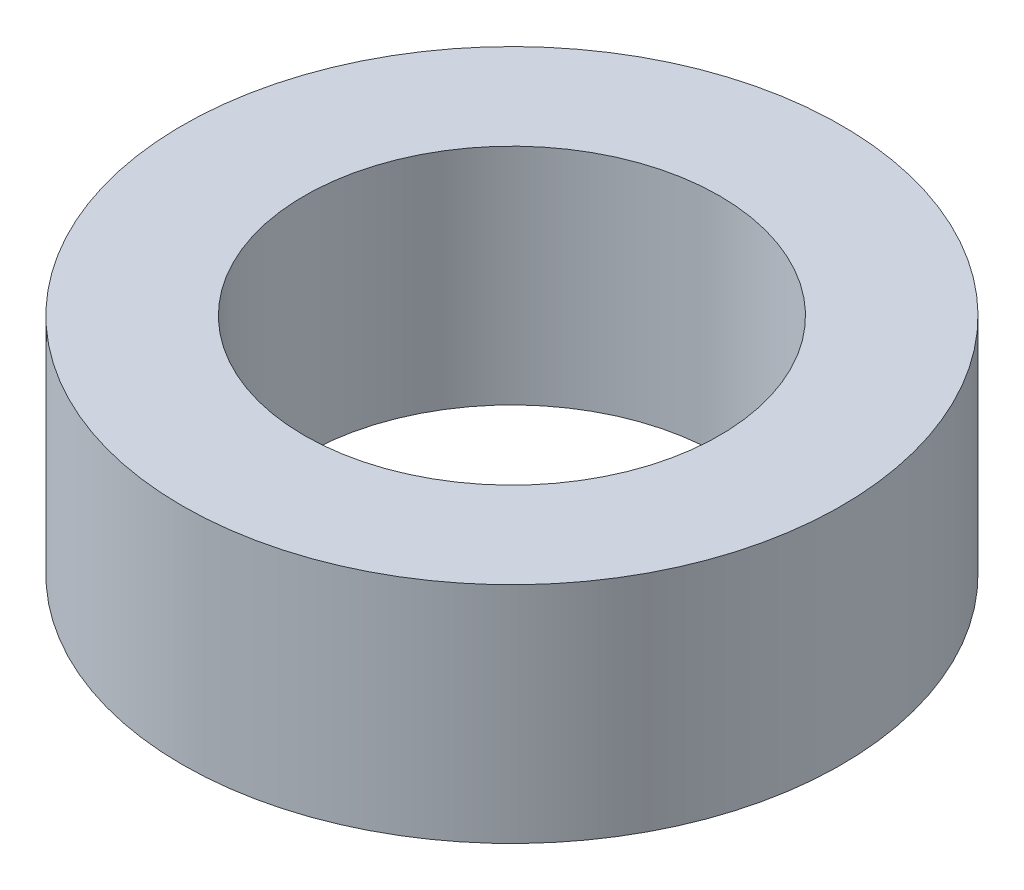
ISO-10303-21;
HEADER;
FILE_DESCRIPTION(('STEP AP214'),'2;1');
FILE_NAME('part.step','',(''),(''),'','','');
FILE_SCHEMA(('AUTOMOTIVE_DESIGN { 1 0 10303 214 1 1 1 1 }'));
ENDSEC;
DATA;
#1=APPLICATION_CONTEXT('core data for automotive mechanical design processes');
#2=APPLICATION_PROTOCOL_DEFINITION('international standard','automotive_design',2000,#1);
#3=PRODUCT_CONTEXT('',#1,'mechanical');
#4=PRODUCT('Part','Part','',(#3));
#5=PRODUCT_RELATED_PRODUCT_CATEGORY('part','',(#4));
#6=PRODUCT_DEFINITION_FORMATION('','',#4);
#7=PRODUCT_DEFINITION_CONTEXT('part definition',#1,'design');
#8=PRODUCT_DEFINITION('design','',#6,#7);
#9=PRODUCT_DEFINITION_SHAPE('','',#8);
#10=(LENGTH_UNIT() NAMED_UNIT(*) SI_UNIT(.MILLI.,.METRE.));
#11=(NAMED_UNIT(*) PLANE_ANGLE_UNIT() SI_UNIT($,.RADIAN.));
#12=(NAMED_UNIT(*) SI_UNIT($,.STERADIAN.) SOLID_ANGLE_UNIT());
#13=UNCERTAINTY_MEASURE_WITH_UNIT(LENGTH_MEASURE(1.E-05),#10,'distance_accuracy_value','');
#14=(GEOMETRIC_REPRESENTATION_CONTEXT(3) GLOBAL_UNCERTAINTY_ASSIGNED_CONTEXT((#13)) GLOBAL_UNIT_ASSIGNED_CONTEXT((#10,
#11,#12)) REPRESENTATION_CONTEXT('',''));
#15=CARTESIAN_POINT('',(0.,0.,0.));
#16=DIRECTION('',(0.,0.,1.));
#17=DIRECTION('',(1.,0.,0.));
#18=AXIS2_PLACEMENT_3D('',#15,#16,#17);
#19=CARTESIAN_POINT('',(0.,4.318,0.));
#20=DIRECTION('',(0.,-1.,0.));
#21=DIRECTION('',(0.,0.,-1.));
#22=AXIS2_PLACEMENT_3D('',#19,#20,#21);
#23=CYLINDRICAL_SURFACE('',#22,6.35);
#24=CARTESIAN_POINT('',(0.,4.318,0.));
#25=DIRECTION('',(0.,1.,0.));
#26=DIRECTION('',(0.,0.,1.));
#27=AXIS2_PLACEMENT_3D('',#24,#25,#26);
#28=CIRCLE('',#27,6.35);
#29=CARTESIAN_POINT('',(0.,4.318,6.35));
#30=VERTEX_POINT('',#29);
#31=EDGE_CURVE('E10',#30,#30,#28,.T.);
#32=ORIENTED_EDGE('',*,*,#31,.F.);
#33=EDGE_LOOP('',(#32));
#34=FACE_BOUND('',#33,.T.);
#35=CARTESIAN_POINT('',(0.,0.,0.));
#36=DIRECTION('',(0.,1.,0.));
#37=DIRECTION('',(0.,0.,1.));
#38=AXIS2_PLACEMENT_3D('',#35,#36,#37);
#39=CIRCLE('',#38,6.35);
#40=CARTESIAN_POINT('',(0.,0.,6.35));
#41=VERTEX_POINT('',#40);
#42=EDGE_CURVE('E48',#41,#41,#39,.T.);
#43=ORIENTED_EDGE('',*,*,#42,.T.);
#44=EDGE_LOOP('',(#43));
#45=FACE_BOUND('',#44,.T.);
#46=ADVANCED_FACE('F45',(#34,#45),#23,.T.);
#47=CARTESIAN_POINT('',(0.,4.318,0.));
#48=DIRECTION('',(0.,1.,0.));
#49=DIRECTION('',(0.,0.,1.));
#50=AXIS2_PLACEMENT_3D('',#47,#48,#49);
#51=PLANE('',#50);
#52=CARTESIAN_POINT('',(0.,4.318,0.));
#53=DIRECTION('',(0.,1.,0.));
#54=DIRECTION('',(0.,0.,1.));
#55=AXIS2_PLACEMENT_3D('',#52,#53,#54);
#56=CIRCLE('',#55,4.);
#57=CARTESIAN_POINT('',(0.,4.318,4.));
#58=VERTEX_POINT('',#57);
#59=EDGE_CURVE('E61',#58,#58,#56,.T.);
#60=ORIENTED_EDGE('',*,*,#59,.F.);
#61=EDGE_LOOP('',(#60));
#62=FACE_BOUND('',#61,.T.);
#63=ORIENTED_EDGE('',*,*,#31,.T.);
#64=EDGE_LOOP('',(#63));
#65=FACE_BOUND('',#64,.T.);
#66=ADVANCED_FACE('F80',(#62,#65),#51,.T.);
#67=CARTESIAN_POINT('',(0.,0.,0.));
#68=DIRECTION('',(0.,1.,0.));
#69=DIRECTION('',(0.,0.,1.));
#70=AXIS2_PLACEMENT_3D('',#67,#68,#69);
#71=PLANE('',#70);
#72=CARTESIAN_POINT('',(0.,0.,0.));
#73=DIRECTION('',(0.,1.,0.));
#74=DIRECTION('',(0.,0.,1.));
#75=AXIS2_PLACEMENT_3D('',#72,#73,#74);
#76=CIRCLE('',#75,4.);
#77=CARTESIAN_POINT('',(0.,0.,4.));
#78=VERTEX_POINT('',#77);
#79=EDGE_CURVE('E59',#78,#78,#76,.T.);
#80=ORIENTED_EDGE('',*,*,#79,.T.);
#81=EDGE_LOOP('',(#80));
#82=FACE_BOUND('',#81,.T.);
#83=ORIENTED_EDGE('',*,*,#42,.F.);
#84=EDGE_LOOP('',(#83));
#85=FACE_BOUND('',#84,.T.);
#86=ADVANCED_FACE('F71',(#82,#85),#71,.F.);
#87=CARTESIAN_POINT('',(0.,0.,0.));
#88=DIRECTION('',(0.,1.,0.));
#89=DIRECTION('',(0.,0.,1.));
#90=AXIS2_PLACEMENT_3D('',#87,#88,#89);
#91=CYLINDRICAL_SURFACE('',#90,4.);
#92=ORIENTED_EDGE('',*,*,#79,.F.);
#93=EDGE_LOOP('',(#92));
#94=FACE_BOUND('',#93,.T.);
#95=ORIENTED_EDGE('',*,*,#59,.T.);
#96=EDGE_LOOP('',(#95));
#97=FACE_BOUND('',#96,.T.);
#98=ADVANCED_FACE('F74',(#94,#97),#91,.F.);
#99=CLOSED_SHELL('',(#46,#66,#86,#98));
#100=MANIFOLD_SOLID_BREP('B2',#99);
#101=ADVANCED_BREP_SHAPE_REPRESENTATION('',(#18,#100),#14);
#102=SHAPE_DEFINITION_REPRESENTATION(#9,#101);
ENDSEC;
END-ISO-10303-21;
